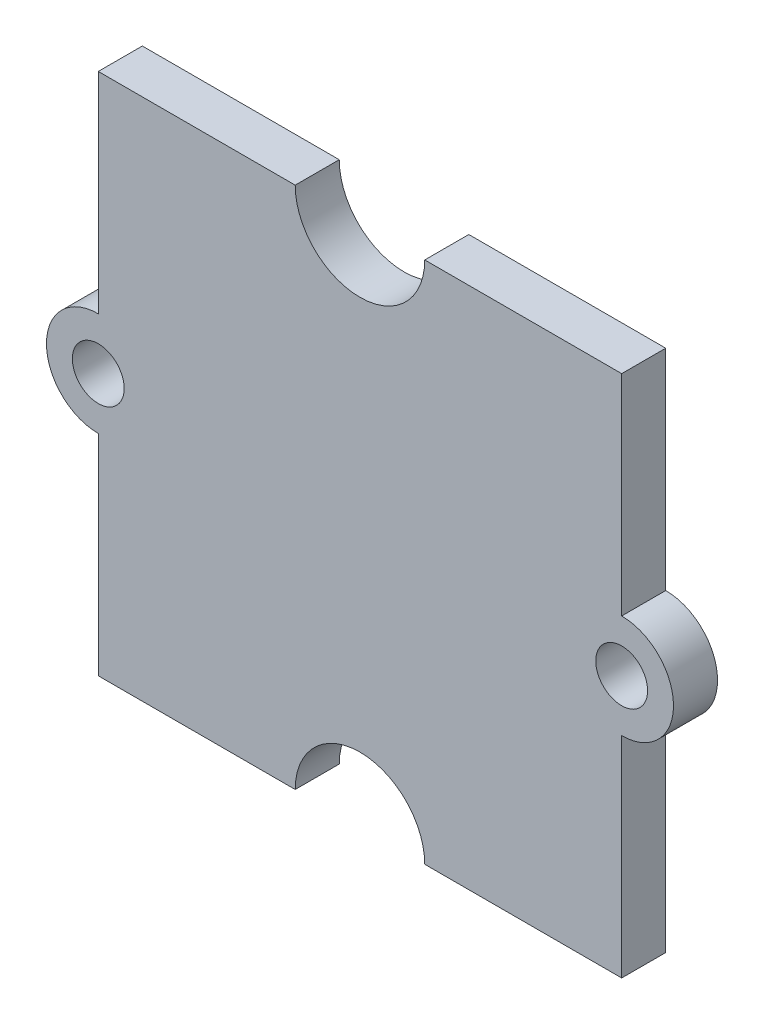
ISO-10303-21;
HEADER;
FILE_DESCRIPTION(('STEP AP214'),'2;1');
FILE_NAME('part.step','',(''),(''),'','','');
FILE_SCHEMA(('AUTOMOTIVE_DESIGN { 1 0 10303 214 1 1 1 1 }'));
ENDSEC;
DATA;
#1=APPLICATION_CONTEXT('core data for automotive mechanical design processes');
#2=APPLICATION_PROTOCOL_DEFINITION('international standard','automotive_design',2000,#1);
#3=PRODUCT_CONTEXT('',#1,'mechanical');
#4=PRODUCT('Part','Part','',(#3));
#5=PRODUCT_RELATED_PRODUCT_CATEGORY('part','',(#4));
#6=PRODUCT_DEFINITION_FORMATION('','',#4);
#7=PRODUCT_DEFINITION_CONTEXT('part definition',#1,'design');
#8=PRODUCT_DEFINITION('design','',#6,#7);
#9=PRODUCT_DEFINITION_SHAPE('','',#8);
#10=(LENGTH_UNIT() NAMED_UNIT(*) SI_UNIT(.MILLI.,.METRE.));
#11=(NAMED_UNIT(*) PLANE_ANGLE_UNIT() SI_UNIT($,.RADIAN.));
#12=(NAMED_UNIT(*) SI_UNIT($,.STERADIAN.) SOLID_ANGLE_UNIT());
#13=UNCERTAINTY_MEASURE_WITH_UNIT(LENGTH_MEASURE(1.E-05),#10,'distance_accuracy_value','');
#14=(GEOMETRIC_REPRESENTATION_CONTEXT(3) GLOBAL_UNCERTAINTY_ASSIGNED_CONTEXT((#13)) GLOBAL_UNIT_ASSIGNED_CONTEXT((#10,
#11,#12)) REPRESENTATION_CONTEXT('',''));
#15=CARTESIAN_POINT('',(0.,0.,0.));
#16=DIRECTION('',(0.,0.,1.));
#17=DIRECTION('',(1.,0.,0.));
#18=AXIS2_PLACEMENT_3D('',#15,#16,#17);
#19=CARTESIAN_POINT('',(0.,10.1,1.7));
#20=DIRECTION('',(0.,0.,1.));
#21=DIRECTION('',(1.,0.,0.));
#22=AXIS2_PLACEMENT_3D('',#19,#20,#21);
#23=PLANE('',#22);
#24=CARTESIAN_POINT('',(-10.1,0.,1.7));
#25=DIRECTION('',(0.,0.,1.));
#26=DIRECTION('',(1.,0.,0.));
#27=AXIS2_PLACEMENT_3D('',#24,#25,#26);
#28=CIRCLE('',#27,1.);
#29=CARTESIAN_POINT('',(-9.1,0.,1.7));
#30=VERTEX_POINT('',#29);
#31=EDGE_CURVE('E170',#30,#30,#28,.T.);
#32=ORIENTED_EDGE('',*,*,#31,.F.);
#33=EDGE_LOOP('',(#32));
#34=FACE_BOUND('',#33,.T.);
#35=DIRECTION('',(0.,-1.,0.));
#36=VECTOR('',#35,1.);
#37=CARTESIAN_POINT('',(-10.1,2.,1.7));
#38=LINE('',#37,#36);
#39=CARTESIAN_POINT('',(-10.1,10.1,1.7));
#40=VERTEX_POINT('',#39);
#41=CARTESIAN_POINT('',(-10.1,2.,1.7));
#42=VERTEX_POINT('',#41);
#43=EDGE_CURVE('E200',#40,#42,#38,.T.);
#44=ORIENTED_EDGE('',*,*,#43,.T.);
#45=CARTESIAN_POINT('',(-10.1,0.,1.7));
#46=DIRECTION('',(0.,0.,1.));
#47=DIRECTION('',(1.,0.,0.));
#48=AXIS2_PLACEMENT_3D('',#45,#46,#47);
#49=CIRCLE('',#48,2.);
#50=CARTESIAN_POINT('',(-10.1,-2.,1.7));
#51=VERTEX_POINT('',#50);
#52=EDGE_CURVE('E112',#42,#51,#49,.T.);
#53=ORIENTED_EDGE('',*,*,#52,.T.);
#54=DIRECTION('',(0.,-1.,0.));
#55=VECTOR('',#54,1.);
#56=CARTESIAN_POINT('',(-10.1,-10.1,1.7));
#57=LINE('',#56,#55);
#58=CARTESIAN_POINT('',(-10.1,-10.1,1.7));
#59=VERTEX_POINT('',#58);
#60=EDGE_CURVE('E237',#51,#59,#57,.T.);
#61=ORIENTED_EDGE('',*,*,#60,.T.);
#62=DIRECTION('',(1.,0.,0.));
#63=VECTOR('',#62,1.);
#64=CARTESIAN_POINT('',(-2.5,-10.1,1.7));
#65=LINE('',#64,#63);
#66=CARTESIAN_POINT('',(-2.5,-10.1,1.7));
#67=VERTEX_POINT('',#66);
#68=EDGE_CURVE('E257',#59,#67,#65,.T.);
#69=ORIENTED_EDGE('',*,*,#68,.T.);
#70=CARTESIAN_POINT('',(0.,-10.1,1.7));
#71=DIRECTION('',(0.,0.,-1.));
#72=DIRECTION('',(1.,0.,0.));
#73=AXIS2_PLACEMENT_3D('',#70,#71,#72);
#74=CIRCLE('',#73,2.5);
#75=CARTESIAN_POINT('',(2.5,-10.1,1.7));
#76=VERTEX_POINT('',#75);
#77=EDGE_CURVE('E253',#67,#76,#74,.T.);
#78=ORIENTED_EDGE('',*,*,#77,.T.);
#79=DIRECTION('',(1.,0.,0.));
#80=VECTOR('',#79,1.);
#81=CARTESIAN_POINT('',(10.1,-10.1,1.7));
#82=LINE('',#81,#80);
#83=CARTESIAN_POINT('',(10.1,-10.1,1.7));
#84=VERTEX_POINT('',#83);
#85=EDGE_CURVE('E256',#76,#84,#82,.T.);
#86=ORIENTED_EDGE('',*,*,#85,.T.);
#87=DIRECTION('',(0.,1.,0.));
#88=VECTOR('',#87,1.);
#89=CARTESIAN_POINT('',(10.1,-10.1,1.7));
#90=LINE('',#89,#88);
#91=CARTESIAN_POINT('',(10.1,-2.,1.7));
#92=VERTEX_POINT('',#91);
#93=EDGE_CURVE('E261',#84,#92,#90,.T.);
#94=ORIENTED_EDGE('',*,*,#93,.T.);
#95=CARTESIAN_POINT('',(10.1,0.,1.7));
#96=DIRECTION('',(0.,0.,1.));
#97=DIRECTION('',(1.,0.,0.));
#98=AXIS2_PLACEMENT_3D('',#95,#96,#97);
#99=CIRCLE('',#98,2.);
#100=CARTESIAN_POINT('',(10.1,2.,1.7));
#101=VERTEX_POINT('',#100);
#102=EDGE_CURVE('E268',#92,#101,#99,.T.);
#103=ORIENTED_EDGE('',*,*,#102,.T.);
#104=DIRECTION('',(0.,1.,0.));
#105=VECTOR('',#104,1.);
#106=CARTESIAN_POINT('',(10.1,2.,1.7));
#107=LINE('',#106,#105);
#108=CARTESIAN_POINT('',(10.1,10.1,1.7));
#109=VERTEX_POINT('',#108);
#110=EDGE_CURVE('E143',#101,#109,#107,.T.);
#111=ORIENTED_EDGE('',*,*,#110,.T.);
#112=DIRECTION('',(-1.,0.,0.));
#113=VECTOR('',#112,1.);
#114=CARTESIAN_POINT('',(10.1,10.1,1.7));
#115=LINE('',#114,#113);
#116=CARTESIAN_POINT('',(2.5,10.1,1.7));
#117=VERTEX_POINT('',#116);
#118=EDGE_CURVE('E137',#109,#117,#115,.T.);
#119=ORIENTED_EDGE('',*,*,#118,.T.);
#120=CARTESIAN_POINT('',(0.,10.1,1.7));
#121=DIRECTION('',(0.,0.,-1.));
#122=DIRECTION('',(1.,0.,0.));
#123=AXIS2_PLACEMENT_3D('',#120,#121,#122);
#124=CIRCLE('',#123,2.5);
#125=CARTESIAN_POINT('',(-2.5,10.1,1.7));
#126=VERTEX_POINT('',#125);
#127=EDGE_CURVE('E141',#117,#126,#124,.T.);
#128=ORIENTED_EDGE('',*,*,#127,.T.);
#129=DIRECTION('',(-1.,0.,0.));
#130=VECTOR('',#129,1.);
#131=CARTESIAN_POINT('',(-2.5,10.1,1.7));
#132=LINE('',#131,#130);
#133=EDGE_CURVE('E57',#126,#40,#132,.T.);
#134=ORIENTED_EDGE('',*,*,#133,.T.);
#135=EDGE_LOOP('',(#44,#53,#61,#69,#78,#86,#94,#103,#111,#119,#128,#134));
#136=FACE_BOUND('',#135,.T.);
#137=CARTESIAN_POINT('',(10.1,0.,1.7));
#138=DIRECTION('',(0.,0.,1.));
#139=DIRECTION('',(1.,0.,0.));
#140=AXIS2_PLACEMENT_3D('',#137,#138,#139);
#141=CIRCLE('',#140,1.);
#142=CARTESIAN_POINT('',(11.1,0.,1.7));
#143=VERTEX_POINT('',#142);
#144=EDGE_CURVE('E312',#143,#143,#141,.T.);
#145=ORIENTED_EDGE('',*,*,#144,.F.);
#146=EDGE_LOOP('',(#145));
#147=FACE_BOUND('',#146,.T.);
#148=ADVANCED_FACE('F39',(#34,#136,#147),#23,.T.);
#149=CARTESIAN_POINT('',(0.,10.1,0.));
#150=DIRECTION('',(0.,0.,1.));
#151=DIRECTION('',(1.,0.,0.));
#152=AXIS2_PLACEMENT_3D('',#149,#150,#151);
#153=PLANE('',#152);
#154=DIRECTION('',(0.,-1.,0.));
#155=VECTOR('',#154,1.);
#156=CARTESIAN_POINT('',(-10.1,2.,0.));
#157=LINE('',#156,#155);
#158=CARTESIAN_POINT('',(-10.1,10.1,0.));
#159=VERTEX_POINT('',#158);
#160=CARTESIAN_POINT('',(-10.1,2.,0.));
#161=VERTEX_POINT('',#160);
#162=EDGE_CURVE('E165',#159,#161,#157,.T.);
#163=ORIENTED_EDGE('',*,*,#162,.F.);
#164=DIRECTION('',(-1.,0.,0.));
#165=VECTOR('',#164,1.);
#166=CARTESIAN_POINT('',(-2.5,10.1,0.));
#167=LINE('',#166,#165);
#168=CARTESIAN_POINT('',(-2.5,10.1,0.));
#169=VERTEX_POINT('',#168);
#170=EDGE_CURVE('E104',#169,#159,#167,.T.);
#171=ORIENTED_EDGE('',*,*,#170,.F.);
#172=CARTESIAN_POINT('',(0.,10.1,0.));
#173=DIRECTION('',(0.,0.,-1.));
#174=DIRECTION('',(1.,0.,0.));
#175=AXIS2_PLACEMENT_3D('',#172,#173,#174);
#176=CIRCLE('',#175,2.5);
#177=CARTESIAN_POINT('',(2.5,10.1,0.));
#178=VERTEX_POINT('',#177);
#179=EDGE_CURVE('E98',#178,#169,#176,.T.);
#180=ORIENTED_EDGE('',*,*,#179,.F.);
#181=DIRECTION('',(-1.,0.,0.));
#182=VECTOR('',#181,1.);
#183=CARTESIAN_POINT('',(10.1,10.1,0.));
#184=LINE('',#183,#182);
#185=CARTESIAN_POINT('',(10.1,10.1,0.));
#186=VERTEX_POINT('',#185);
#187=EDGE_CURVE('E152',#186,#178,#184,.T.);
#188=ORIENTED_EDGE('',*,*,#187,.F.);
#189=DIRECTION('',(0.,1.,0.));
#190=VECTOR('',#189,1.);
#191=CARTESIAN_POINT('',(10.1,2.,0.));
#192=LINE('',#191,#190);
#193=CARTESIAN_POINT('',(10.1,2.,0.));
#194=VERTEX_POINT('',#193);
#195=EDGE_CURVE('E191',#194,#186,#192,.T.);
#196=ORIENTED_EDGE('',*,*,#195,.F.);
#197=CARTESIAN_POINT('',(10.1,0.,0.));
#198=DIRECTION('',(0.,0.,1.));
#199=DIRECTION('',(1.,0.,0.));
#200=AXIS2_PLACEMENT_3D('',#197,#198,#199);
#201=CIRCLE('',#200,2.);
#202=CARTESIAN_POINT('',(10.1,-2.,0.));
#203=VERTEX_POINT('',#202);
#204=EDGE_CURVE('E188',#203,#194,#201,.T.);
#205=ORIENTED_EDGE('',*,*,#204,.F.);
#206=DIRECTION('',(0.,1.,0.));
#207=VECTOR('',#206,1.);
#208=CARTESIAN_POINT('',(10.1,-10.1,0.));
#209=LINE('',#208,#207);
#210=CARTESIAN_POINT('',(10.1,-10.1,0.));
#211=VERTEX_POINT('',#210);
#212=EDGE_CURVE('E185',#211,#203,#209,.T.);
#213=ORIENTED_EDGE('',*,*,#212,.F.);
#214=DIRECTION('',(1.,0.,0.));
#215=VECTOR('',#214,1.);
#216=CARTESIAN_POINT('',(10.1,-10.1,0.));
#217=LINE('',#216,#215);
#218=CARTESIAN_POINT('',(2.5,-10.1,0.));
#219=VERTEX_POINT('',#218);
#220=EDGE_CURVE('E182',#219,#211,#217,.T.);
#221=ORIENTED_EDGE('',*,*,#220,.F.);
#222=CARTESIAN_POINT('',(0.,-10.1,0.));
#223=DIRECTION('',(0.,0.,-1.));
#224=DIRECTION('',(1.,0.,0.));
#225=AXIS2_PLACEMENT_3D('',#222,#223,#224);
#226=CIRCLE('',#225,2.5);
#227=CARTESIAN_POINT('',(-2.5,-10.1,0.));
#228=VERTEX_POINT('',#227);
#229=EDGE_CURVE('E179',#228,#219,#226,.T.);
#230=ORIENTED_EDGE('',*,*,#229,.F.);
#231=DIRECTION('',(1.,0.,0.));
#232=VECTOR('',#231,1.);
#233=CARTESIAN_POINT('',(-2.5,-10.1,0.));
#234=LINE('',#233,#232);
#235=CARTESIAN_POINT('',(-10.1,-10.1,0.));
#236=VERTEX_POINT('',#235);
#237=EDGE_CURVE('E176',#236,#228,#234,.T.);
#238=ORIENTED_EDGE('',*,*,#237,.F.);
#239=DIRECTION('',(0.,-1.,0.));
#240=VECTOR('',#239,1.);
#241=CARTESIAN_POINT('',(-10.1,-10.1,0.));
#242=LINE('',#241,#240);
#243=CARTESIAN_POINT('',(-10.1,-2.,0.));
#244=VERTEX_POINT('',#243);
#245=EDGE_CURVE('E173',#244,#236,#242,.T.);
#246=ORIENTED_EDGE('',*,*,#245,.F.);
#247=CARTESIAN_POINT('',(-10.1,0.,0.));
#248=DIRECTION('',(0.,0.,1.));
#249=DIRECTION('',(1.,0.,0.));
#250=AXIS2_PLACEMENT_3D('',#247,#248,#249);
#251=CIRCLE('',#250,2.);
#252=EDGE_CURVE('E169',#161,#244,#251,.T.);
#253=ORIENTED_EDGE('',*,*,#252,.F.);
#254=EDGE_LOOP('',(#163,#171,#180,#188,#196,#205,#213,#221,#230,#238,#246,#253));
#255=FACE_BOUND('',#254,.T.);
#256=CARTESIAN_POINT('',(-10.1,0.,0.));
#257=DIRECTION('',(0.,0.,1.));
#258=DIRECTION('',(1.,0.,0.));
#259=AXIS2_PLACEMENT_3D('',#256,#257,#258);
#260=CIRCLE('',#259,1.);
#261=CARTESIAN_POINT('',(-9.1,0.,0.));
#262=VERTEX_POINT('',#261);
#263=EDGE_CURVE('E320',#262,#262,#260,.T.);
#264=ORIENTED_EDGE('',*,*,#263,.T.);
#265=EDGE_LOOP('',(#264));
#266=FACE_BOUND('',#265,.T.);
#267=CARTESIAN_POINT('',(10.1,0.,0.));
#268=DIRECTION('',(0.,0.,1.));
#269=DIRECTION('',(1.,0.,0.));
#270=AXIS2_PLACEMENT_3D('',#267,#268,#269);
#271=CIRCLE('',#270,1.);
#272=CARTESIAN_POINT('',(11.1,0.,0.));
#273=VERTEX_POINT('',#272);
#274=EDGE_CURVE('E315',#273,#273,#271,.T.);
#275=ORIENTED_EDGE('',*,*,#274,.T.);
#276=EDGE_LOOP('',(#275));
#277=FACE_BOUND('',#276,.T.);
#278=ADVANCED_FACE('F241',(#255,#266,#277),#153,.F.);
#279=CARTESIAN_POINT('',(-10.1,2.,1.7));
#280=DIRECTION('',(1.,0.,0.));
#281=DIRECTION('',(0.,0.,-1.));
#282=AXIS2_PLACEMENT_3D('',#279,#280,#281);
#283=PLANE('',#282);
#284=ORIENTED_EDGE('',*,*,#162,.T.);
#285=DIRECTION('',(0.,0.,-1.));
#286=VECTOR('',#285,1.);
#287=CARTESIAN_POINT('',(-10.1,2.,1.7));
#288=LINE('',#287,#286);
#289=EDGE_CURVE('E11',#42,#161,#288,.T.);
#290=ORIENTED_EDGE('',*,*,#289,.F.);
#291=ORIENTED_EDGE('',*,*,#43,.F.);
#292=DIRECTION('',(0.,0.,-1.));
#293=VECTOR('',#292,1.);
#294=CARTESIAN_POINT('',(-10.1,10.1,1.7));
#295=LINE('',#294,#293);
#296=EDGE_CURVE('E161',#40,#159,#295,.T.);
#297=ORIENTED_EDGE('',*,*,#296,.T.);
#298=EDGE_LOOP('',(#284,#290,#291,#297));
#299=FACE_BOUND('',#298,.T.);
#300=ADVANCED_FACE('F41',(#299),#283,.F.);
#301=CARTESIAN_POINT('',(-10.1,0.,1.7));
#302=DIRECTION('',(0.,0.,-1.));
#303=DIRECTION('',(-1.,0.,0.));
#304=AXIS2_PLACEMENT_3D('',#301,#302,#303);
#305=CYLINDRICAL_SURFACE('',#304,2.);
#306=ORIENTED_EDGE('',*,*,#252,.T.);
#307=DIRECTION('',(0.,0.,-1.));
#308=VECTOR('',#307,1.);
#309=CARTESIAN_POINT('',(-10.1,-2.,1.7));
#310=LINE('',#309,#308);
#311=EDGE_CURVE('E49',#51,#244,#310,.T.);
#312=ORIENTED_EDGE('',*,*,#311,.F.);
#313=ORIENTED_EDGE('',*,*,#52,.F.);
#314=ORIENTED_EDGE('',*,*,#289,.T.);
#315=EDGE_LOOP('',(#306,#312,#313,#314));
#316=FACE_BOUND('',#315,.T.);
#317=ADVANCED_FACE('F418',(#316),#305,.T.);
#318=CARTESIAN_POINT('',(-10.1,-10.1,1.7));
#319=DIRECTION('',(1.,0.,0.));
#320=DIRECTION('',(0.,0.,-1.));
#321=AXIS2_PLACEMENT_3D('',#318,#319,#320);
#322=PLANE('',#321);
#323=ORIENTED_EDGE('',*,*,#245,.T.);
#324=DIRECTION('',(0.,0.,-1.));
#325=VECTOR('',#324,1.);
#326=CARTESIAN_POINT('',(-10.1,-10.1,1.7));
#327=LINE('',#326,#325);
#328=EDGE_CURVE('E227',#59,#236,#327,.T.);
#329=ORIENTED_EDGE('',*,*,#328,.F.);
#330=ORIENTED_EDGE('',*,*,#60,.F.);
#331=ORIENTED_EDGE('',*,*,#311,.T.);
#332=EDGE_LOOP('',(#323,#329,#330,#331));
#333=FACE_BOUND('',#332,.T.);
#334=ADVANCED_FACE('F235',(#333),#322,.F.);
#335=CARTESIAN_POINT('',(-2.5,-10.1,1.7));
#336=DIRECTION('',(0.,1.,0.));
#337=DIRECTION('',(-1.,0.,0.));
#338=AXIS2_PLACEMENT_3D('',#335,#336,#337);
#339=PLANE('',#338);
#340=ORIENTED_EDGE('',*,*,#237,.T.);
#341=DIRECTION('',(0.,0.,-1.));
#342=VECTOR('',#341,1.);
#343=CARTESIAN_POINT('',(-2.5,-10.1,1.7));
#344=LINE('',#343,#342);
#345=EDGE_CURVE('E223',#67,#228,#344,.T.);
#346=ORIENTED_EDGE('',*,*,#345,.F.);
#347=ORIENTED_EDGE('',*,*,#68,.F.);
#348=ORIENTED_EDGE('',*,*,#328,.T.);
#349=EDGE_LOOP('',(#340,#346,#347,#348));
#350=FACE_BOUND('',#349,.T.);
#351=ADVANCED_FACE('F247',(#350),#339,.F.);
#352=CARTESIAN_POINT('',(0.,-10.1,1.7));
#353=DIRECTION('',(0.,0.,-1.));
#354=DIRECTION('',(-1.,0.,0.));
#355=AXIS2_PLACEMENT_3D('',#352,#353,#354);
#356=CYLINDRICAL_SURFACE('',#355,2.5);
#357=ORIENTED_EDGE('',*,*,#229,.T.);
#358=DIRECTION('',(0.,0.,-1.));
#359=VECTOR('',#358,1.);
#360=CARTESIAN_POINT('',(2.5,-10.1,1.7));
#361=LINE('',#360,#359);
#362=EDGE_CURVE('E219',#76,#219,#361,.T.);
#363=ORIENTED_EDGE('',*,*,#362,.F.);
#364=ORIENTED_EDGE('',*,*,#77,.F.);
#365=ORIENTED_EDGE('',*,*,#345,.T.);
#366=EDGE_LOOP('',(#357,#363,#364,#365));
#367=FACE_BOUND('',#366,.T.);
#368=ADVANCED_FACE('F251',(#367),#356,.F.);
#369=CARTESIAN_POINT('',(10.1,-10.1,1.7));
#370=DIRECTION('',(0.,1.,0.));
#371=DIRECTION('',(0.,0.,1.));
#372=AXIS2_PLACEMENT_3D('',#369,#370,#371);
#373=PLANE('',#372);
#374=ORIENTED_EDGE('',*,*,#220,.T.);
#375=DIRECTION('',(0.,0.,-1.));
#376=VECTOR('',#375,1.);
#377=CARTESIAN_POINT('',(10.1,-10.1,1.7));
#378=LINE('',#377,#376);
#379=EDGE_CURVE('E215',#84,#211,#378,.T.);
#380=ORIENTED_EDGE('',*,*,#379,.F.);
#381=ORIENTED_EDGE('',*,*,#85,.F.);
#382=ORIENTED_EDGE('',*,*,#362,.T.);
#383=EDGE_LOOP('',(#374,#380,#381,#382));
#384=FACE_BOUND('',#383,.T.);
#385=ADVANCED_FACE('F383',(#384),#373,.F.);
#386=CARTESIAN_POINT('',(10.1,-10.1,1.7));
#387=DIRECTION('',(-1.,0.,0.));
#388=DIRECTION('',(0.,0.,1.));
#389=AXIS2_PLACEMENT_3D('',#386,#387,#388);
#390=PLANE('',#389);
#391=ORIENTED_EDGE('',*,*,#212,.T.);
#392=DIRECTION('',(0.,0.,-1.));
#393=VECTOR('',#392,1.);
#394=CARTESIAN_POINT('',(10.1,-2.,1.7));
#395=LINE('',#394,#393);
#396=EDGE_CURVE('E211',#92,#203,#395,.T.);
#397=ORIENTED_EDGE('',*,*,#396,.F.);
#398=ORIENTED_EDGE('',*,*,#93,.F.);
#399=ORIENTED_EDGE('',*,*,#379,.T.);
#400=EDGE_LOOP('',(#391,#397,#398,#399));
#401=FACE_BOUND('',#400,.T.);
#402=ADVANCED_FACE('F374',(#401),#390,.F.);
#403=CARTESIAN_POINT('',(10.1,0.,1.7));
#404=DIRECTION('',(0.,0.,-1.));
#405=DIRECTION('',(-1.,0.,0.));
#406=AXIS2_PLACEMENT_3D('',#403,#404,#405);
#407=CYLINDRICAL_SURFACE('',#406,2.);
#408=ORIENTED_EDGE('',*,*,#204,.T.);
#409=DIRECTION('',(0.,0.,-1.));
#410=VECTOR('',#409,1.);
#411=CARTESIAN_POINT('',(10.1,2.,1.7));
#412=LINE('',#411,#410);
#413=EDGE_CURVE('E207',#101,#194,#412,.T.);
#414=ORIENTED_EDGE('',*,*,#413,.F.);
#415=ORIENTED_EDGE('',*,*,#102,.F.);
#416=ORIENTED_EDGE('',*,*,#396,.T.);
#417=EDGE_LOOP('',(#408,#414,#415,#416));
#418=FACE_BOUND('',#417,.T.);
#419=ADVANCED_FACE('F276',(#418),#407,.T.);
#420=CARTESIAN_POINT('',(10.1,2.,1.7));
#421=DIRECTION('',(-1.,0.,0.));
#422=DIRECTION('',(0.,0.,1.));
#423=AXIS2_PLACEMENT_3D('',#420,#421,#422);
#424=PLANE('',#423);
#425=ORIENTED_EDGE('',*,*,#195,.T.);
#426=DIRECTION('',(0.,0.,-1.));
#427=VECTOR('',#426,1.);
#428=CARTESIAN_POINT('',(10.1,10.1,1.7));
#429=LINE('',#428,#427);
#430=EDGE_CURVE('E154',#109,#186,#429,.T.);
#431=ORIENTED_EDGE('',*,*,#430,.F.);
#432=ORIENTED_EDGE('',*,*,#110,.F.);
#433=ORIENTED_EDGE('',*,*,#413,.T.);
#434=EDGE_LOOP('',(#425,#431,#432,#433));
#435=FACE_BOUND('',#434,.T.);
#436=ADVANCED_FACE('F280',(#435),#424,.F.);
#437=CARTESIAN_POINT('',(10.1,10.1,1.7));
#438=DIRECTION('',(0.,-1.,0.));
#439=DIRECTION('',(1.,0.,0.));
#440=AXIS2_PLACEMENT_3D('',#437,#438,#439);
#441=PLANE('',#440);
#442=ORIENTED_EDGE('',*,*,#187,.T.);
#443=DIRECTION('',(0.,0.,-1.));
#444=VECTOR('',#443,1.);
#445=CARTESIAN_POINT('',(2.5,10.1,1.7));
#446=LINE('',#445,#444);
#447=EDGE_CURVE('E149',#117,#178,#446,.T.);
#448=ORIENTED_EDGE('',*,*,#447,.F.);
#449=ORIENTED_EDGE('',*,*,#118,.F.);
#450=ORIENTED_EDGE('',*,*,#430,.T.);
#451=EDGE_LOOP('',(#442,#448,#449,#450));
#452=FACE_BOUND('',#451,.T.);
#453=ADVANCED_FACE('F150',(#452),#441,.F.);
#454=CARTESIAN_POINT('',(0.,10.1,1.7));
#455=DIRECTION('',(0.,0.,-1.));
#456=DIRECTION('',(-1.,0.,0.));
#457=AXIS2_PLACEMENT_3D('',#454,#455,#456);
#458=CYLINDRICAL_SURFACE('',#457,2.5);
#459=ORIENTED_EDGE('',*,*,#179,.T.);
#460=DIRECTION('',(0.,0.,-1.));
#461=VECTOR('',#460,1.);
#462=CARTESIAN_POINT('',(-2.5,10.1,1.7));
#463=LINE('',#462,#461);
#464=EDGE_CURVE('E155',#126,#169,#463,.T.);
#465=ORIENTED_EDGE('',*,*,#464,.F.);
#466=ORIENTED_EDGE('',*,*,#127,.F.);
#467=ORIENTED_EDGE('',*,*,#447,.T.);
#468=EDGE_LOOP('',(#459,#465,#466,#467));
#469=FACE_BOUND('',#468,.T.);
#470=ADVANCED_FACE('F157',(#469),#458,.F.);
#471=CARTESIAN_POINT('',(-2.5,10.1,1.7));
#472=DIRECTION('',(0.,-1.,0.));
#473=DIRECTION('',(1.,0.,0.));
#474=AXIS2_PLACEMENT_3D('',#471,#472,#473);
#475=PLANE('',#474);
#476=ORIENTED_EDGE('',*,*,#170,.T.);
#477=ORIENTED_EDGE('',*,*,#296,.F.);
#478=ORIENTED_EDGE('',*,*,#133,.F.);
#479=ORIENTED_EDGE('',*,*,#464,.T.);
#480=EDGE_LOOP('',(#476,#477,#478,#479));
#481=FACE_BOUND('',#480,.T.);
#482=ADVANCED_FACE('F284',(#481),#475,.F.);
#483=CARTESIAN_POINT('',(-10.1,0.,1.7));
#484=DIRECTION('',(0.,0.,-1.));
#485=DIRECTION('',(-1.,0.,0.));
#486=AXIS2_PLACEMENT_3D('',#483,#484,#485);
#487=CYLINDRICAL_SURFACE('',#486,1.);
#488=ORIENTED_EDGE('',*,*,#31,.T.);
#489=EDGE_LOOP('',(#488));
#490=FACE_BOUND('',#489,.T.);
#491=ORIENTED_EDGE('',*,*,#263,.F.);
#492=EDGE_LOOP('',(#491));
#493=FACE_BOUND('',#492,.T.);
#494=ADVANCED_FACE('F286',(#490,#493),#487,.F.);
#495=CARTESIAN_POINT('',(10.1,0.,1.7));
#496=DIRECTION('',(0.,0.,-1.));
#497=DIRECTION('',(-1.,0.,0.));
#498=AXIS2_PLACEMENT_3D('',#495,#496,#497);
#499=CYLINDRICAL_SURFACE('',#498,1.);
#500=ORIENTED_EDGE('',*,*,#144,.T.);
#501=EDGE_LOOP('',(#500));
#502=FACE_BOUND('',#501,.T.);
#503=ORIENTED_EDGE('',*,*,#274,.F.);
#504=EDGE_LOOP('',(#503));
#505=FACE_BOUND('',#504,.T.);
#506=ADVANCED_FACE('F292',(#502,#505),#499,.F.);
#507=CLOSED_SHELL('',(#148,#278,#300,#317,#334,#351,#368,#385,#402,#419,#436,#453,#470,#482,
#494,#506));
#508=MANIFOLD_SOLID_BREP('B2',#507);
#509=ADVANCED_BREP_SHAPE_REPRESENTATION('',(#18,#508),#14);
#510=SHAPE_DEFINITION_REPRESENTATION(#9,#509);
ENDSEC;
END-ISO-10303-21;
